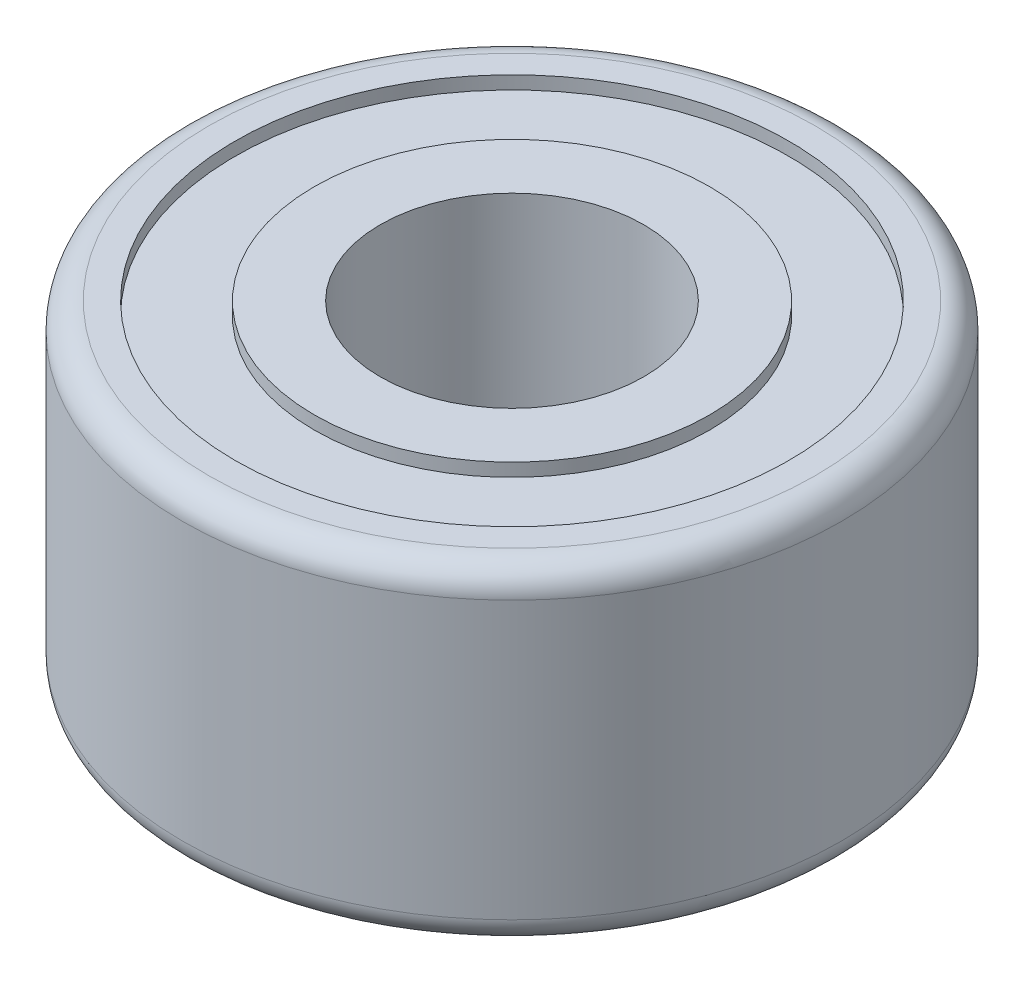
ISO-10303-21;
HEADER;
FILE_DESCRIPTION(('STEP AP214'),'2;1');
FILE_NAME('part.step','',(''),(''),'','','');
FILE_SCHEMA(('AUTOMOTIVE_DESIGN { 1 0 10303 214 1 1 1 1 }'));
ENDSEC;
DATA;
#1=APPLICATION_CONTEXT('core data for automotive mechanical design processes');
#2=APPLICATION_PROTOCOL_DEFINITION('international standard','automotive_design',2000,#1);
#3=PRODUCT_CONTEXT('',#1,'mechanical');
#4=PRODUCT('Part','Part','',(#3));
#5=PRODUCT_RELATED_PRODUCT_CATEGORY('part','',(#4));
#6=PRODUCT_DEFINITION_FORMATION('','',#4);
#7=PRODUCT_DEFINITION_CONTEXT('part definition',#1,'design');
#8=PRODUCT_DEFINITION('design','',#6,#7);
#9=PRODUCT_DEFINITION_SHAPE('','',#8);
#10=(LENGTH_UNIT() NAMED_UNIT(*) SI_UNIT(.MILLI.,.METRE.));
#11=(NAMED_UNIT(*) PLANE_ANGLE_UNIT() SI_UNIT($,.RADIAN.));
#12=(NAMED_UNIT(*) SI_UNIT($,.STERADIAN.) SOLID_ANGLE_UNIT());
#13=UNCERTAINTY_MEASURE_WITH_UNIT(LENGTH_MEASURE(1.E-05),#10,'distance_accuracy_value','');
#14=(GEOMETRIC_REPRESENTATION_CONTEXT(3) GLOBAL_UNCERTAINTY_ASSIGNED_CONTEXT((#13)) GLOBAL_UNIT_ASSIGNED_CONTEXT((#10,
#11,#12)) REPRESENTATION_CONTEXT('',''));
#15=CARTESIAN_POINT('',(0.,0.,0.));
#16=DIRECTION('',(0.,0.,1.));
#17=DIRECTION('',(1.,0.,0.));
#18=AXIS2_PLACEMENT_3D('',#15,#16,#17);
#19=CARTESIAN_POINT('',(0.,0.,0.));
#20=DIRECTION('',(0.,1.,0.));
#21=DIRECTION('',(0.,0.,1.));
#22=AXIS2_PLACEMENT_3D('',#19,#20,#21);
#23=PLANE('',#22);
#24=CARTESIAN_POINT('',(0.,0.,0.));
#25=DIRECTION('',(0.,1.,0.));
#26=DIRECTION('',(0.,0.,1.));
#27=AXIS2_PLACEMENT_3D('',#24,#25,#26);
#28=CIRCLE('',#27,1.);
#29=CARTESIAN_POINT('',(0.,0.,1.));
#30=VERTEX_POINT('',#29);
#31=EDGE_CURVE('E59',#30,#30,#28,.T.);
#32=ORIENTED_EDGE('',*,*,#31,.T.);
#33=EDGE_LOOP('',(#32));
#34=FACE_BOUND('',#33,.T.);
#35=CARTESIAN_POINT('',(0.,0.,0.));
#36=DIRECTION('',(0.,-1.,0.));
#37=DIRECTION('',(0.,0.,-1.));
#38=AXIS2_PLACEMENT_3D('',#35,#36,#37);
#39=CIRCLE('',#38,1.5);
#40=CARTESIAN_POINT('',(0.,0.,-1.5));
#41=VERTEX_POINT('',#40);
#42=EDGE_CURVE('E85',#41,#41,#39,.T.);
#43=ORIENTED_EDGE('',*,*,#42,.T.);
#44=EDGE_LOOP('',(#43));
#45=FACE_BOUND('',#44,.T.);
#46=ADVANCED_FACE('F40',(#34,#45),#23,.F.);
#47=CARTESIAN_POINT('',(0.,2.5,0.));
#48=DIRECTION('',(0.,1.,0.));
#49=DIRECTION('',(0.,0.,1.));
#50=AXIS2_PLACEMENT_3D('',#47,#48,#49);
#51=PLANE('',#50);
#52=CARTESIAN_POINT('',(0.,2.5,0.));
#53=DIRECTION('',(0.,1.,0.));
#54=DIRECTION('',(0.,0.,1.));
#55=AXIS2_PLACEMENT_3D('',#52,#53,#54);
#56=CIRCLE('',#55,1.);
#57=CARTESIAN_POINT('',(0.,2.5,1.));
#58=VERTEX_POINT('',#57);
#59=EDGE_CURVE('E60',#58,#58,#56,.T.);
#60=ORIENTED_EDGE('',*,*,#59,.F.);
#61=EDGE_LOOP('',(#60));
#62=FACE_BOUND('',#61,.T.);
#63=CARTESIAN_POINT('',(0.,2.5,0.));
#64=DIRECTION('',(0.,1.,0.));
#65=DIRECTION('',(0.,0.,1.));
#66=AXIS2_PLACEMENT_3D('',#63,#64,#65);
#67=CIRCLE('',#66,1.5);
#68=CARTESIAN_POINT('',(0.,2.5,1.5));
#69=VERTEX_POINT('',#68);
#70=EDGE_CURVE('E69',#69,#69,#67,.T.);
#71=ORIENTED_EDGE('',*,*,#70,.T.);
#72=EDGE_LOOP('',(#71));
#73=FACE_BOUND('',#72,.T.);
#74=ADVANCED_FACE('F116',(#62,#73),#51,.T.);
#75=CARTESIAN_POINT('',(0.,2.5,0.));
#76=DIRECTION('',(0.,1.,0.));
#77=DIRECTION('',(0.,0.,1.));
#78=AXIS2_PLACEMENT_3D('',#75,#76,#77);
#79=CIRCLE('',#78,2.1);
#80=CARTESIAN_POINT('',(0.,2.5,2.1));
#81=VERTEX_POINT('',#80);
#82=EDGE_CURVE('E63',#81,#81,#79,.T.);
#83=ORIENTED_EDGE('',*,*,#82,.F.);
#84=EDGE_LOOP('',(#83));
#85=FACE_BOUND('',#84,.T.);
#86=CARTESIAN_POINT('',(0.,2.5,0.));
#87=DIRECTION('',(0.,1.,0.));
#88=DIRECTION('',(0.,0.,1.));
#89=AXIS2_PLACEMENT_3D('',#86,#87,#88);
#90=CIRCLE('',#89,2.3);
#91=CARTESIAN_POINT('',(0.,2.5,2.3));
#92=VERTEX_POINT('',#91);
#93=EDGE_CURVE('E10',#92,#92,#90,.T.);
#94=ORIENTED_EDGE('',*,*,#93,.T.);
#95=EDGE_LOOP('',(#94));
#96=FACE_BOUND('',#95,.T.);
#97=ADVANCED_FACE('F110',(#85,#96),#51,.T.);
#98=CARTESIAN_POINT('',(0.,0.,0.));
#99=DIRECTION('',(0.,-1.,0.));
#100=DIRECTION('',(0.,0.,-1.));
#101=AXIS2_PLACEMENT_3D('',#98,#99,#100);
#102=CIRCLE('',#101,2.1);
#103=CARTESIAN_POINT('',(0.,0.,-2.1));
#104=VERTEX_POINT('',#103);
#105=EDGE_CURVE('E79',#104,#104,#102,.T.);
#106=ORIENTED_EDGE('',*,*,#105,.F.);
#107=EDGE_LOOP('',(#106));
#108=FACE_BOUND('',#107,.T.);
#109=CARTESIAN_POINT('',(0.,0.,0.));
#110=DIRECTION('',(0.,1.,0.));
#111=DIRECTION('',(0.,0.,1.));
#112=AXIS2_PLACEMENT_3D('',#109,#110,#111);
#113=CIRCLE('',#112,2.3);
#114=CARTESIAN_POINT('',(0.,0.,2.3));
#115=VERTEX_POINT('',#114);
#116=EDGE_CURVE('E42',#115,#115,#113,.F.);
#117=ORIENTED_EDGE('',*,*,#116,.T.);
#118=EDGE_LOOP('',(#117));
#119=FACE_BOUND('',#118,.T.);
#120=ADVANCED_FACE('F102',(#108,#119),#23,.F.);
#121=CARTESIAN_POINT('',(0.,2.5,0.));
#122=DIRECTION('',(0.,-1.,0.));
#123=DIRECTION('',(0.,0.,-1.));
#124=AXIS2_PLACEMENT_3D('',#121,#122,#123);
#125=CYLINDRICAL_SURFACE('',#124,2.5);
#126=CARTESIAN_POINT('',(0.,0.2,0.));
#127=DIRECTION('',(0.,1.,0.));
#128=DIRECTION('',(0.,0.,1.));
#129=AXIS2_PLACEMENT_3D('',#126,#127,#128);
#130=CIRCLE('',#129,2.5);
#131=CARTESIAN_POINT('',(0.,0.2,2.5));
#132=VERTEX_POINT('',#131);
#133=EDGE_CURVE('E48',#132,#132,#130,.T.);
#134=ORIENTED_EDGE('',*,*,#133,.T.);
#135=EDGE_LOOP('',(#134));
#136=FACE_BOUND('',#135,.T.);
#137=CARTESIAN_POINT('',(0.,2.3,0.));
#138=DIRECTION('',(0.,1.,0.));
#139=DIRECTION('',(0.,0.,1.));
#140=AXIS2_PLACEMENT_3D('',#137,#138,#139);
#141=CIRCLE('',#140,2.5);
#142=CARTESIAN_POINT('',(0.,2.3,2.5));
#143=VERTEX_POINT('',#142);
#144=EDGE_CURVE('E55',#143,#143,#141,.F.);
#145=ORIENTED_EDGE('',*,*,#144,.T.);
#146=EDGE_LOOP('',(#145));
#147=FACE_BOUND('',#146,.T.);
#148=ADVANCED_FACE('F106',(#136,#147),#125,.T.);
#149=CARTESIAN_POINT('',(0.,2.5,0.));
#150=DIRECTION('',(0.,-1.,0.));
#151=DIRECTION('',(0.,0.,-1.));
#152=AXIS2_PLACEMENT_3D('',#149,#150,#151);
#153=CYLINDRICAL_SURFACE('',#152,1.);
#154=ORIENTED_EDGE('',*,*,#59,.T.);
#155=EDGE_LOOP('',(#154));
#156=FACE_BOUND('',#155,.T.);
#157=ORIENTED_EDGE('',*,*,#31,.F.);
#158=EDGE_LOOP('',(#157));
#159=FACE_BOUND('',#158,.T.);
#160=ADVANCED_FACE('F114',(#156,#159),#153,.F.);
#161=CARTESIAN_POINT('',(0.,0.2,0.));
#162=DIRECTION('',(0.,1.,0.));
#163=DIRECTION('',(0.,0.,1.));
#164=AXIS2_PLACEMENT_3D('',#161,#162,#163);
#165=TOROIDAL_SURFACE('',#164,2.3,0.2);
#166=ORIENTED_EDGE('',*,*,#116,.F.);
#167=EDGE_LOOP('',(#166));
#168=FACE_BOUND('',#167,.T.);
#169=ORIENTED_EDGE('',*,*,#133,.F.);
#170=EDGE_LOOP('',(#169));
#171=FACE_BOUND('',#170,.T.);
#172=ADVANCED_FACE('F144',(#168,#171),#165,.T.);
#173=CARTESIAN_POINT('',(0.,2.3,0.));
#174=DIRECTION('',(0.,1.,0.));
#175=DIRECTION('',(0.,0.,1.));
#176=AXIS2_PLACEMENT_3D('',#173,#174,#175);
#177=TOROIDAL_SURFACE('',#176,2.3,0.2);
#178=ORIENTED_EDGE('',*,*,#144,.F.);
#179=EDGE_LOOP('',(#178));
#180=FACE_BOUND('',#179,.T.);
#181=ORIENTED_EDGE('',*,*,#93,.F.);
#182=EDGE_LOOP('',(#181));
#183=FACE_BOUND('',#182,.T.);
#184=ADVANCED_FACE('F39',(#180,#183),#177,.T.);
#185=CARTESIAN_POINT('',(0.,2.4,0.));
#186=DIRECTION('',(0.,1.,0.));
#187=DIRECTION('',(0.,0.,1.));
#188=AXIS2_PLACEMENT_3D('',#185,#186,#187);
#189=CYLINDRICAL_SURFACE('',#188,2.1);
#190=CARTESIAN_POINT('',(0.,2.4,0.));
#191=DIRECTION('',(0.,1.,0.));
#192=DIRECTION('',(0.,0.,1.));
#193=AXIS2_PLACEMENT_3D('',#190,#191,#192);
#194=CIRCLE('',#193,2.1);
#195=CARTESIAN_POINT('',(0.,2.4,2.1));
#196=VERTEX_POINT('',#195);
#197=EDGE_CURVE('E64',#196,#196,#194,.T.);
#198=ORIENTED_EDGE('',*,*,#197,.F.);
#199=EDGE_LOOP('',(#198));
#200=FACE_BOUND('',#199,.T.);
#201=ORIENTED_EDGE('',*,*,#82,.T.);
#202=EDGE_LOOP('',(#201));
#203=FACE_BOUND('',#202,.T.);
#204=ADVANCED_FACE('F137',(#200,#203),#189,.F.);
#205=CARTESIAN_POINT('',(0.,2.4,0.));
#206=DIRECTION('',(0.,1.,0.));
#207=DIRECTION('',(0.,0.,1.));
#208=AXIS2_PLACEMENT_3D('',#205,#206,#207);
#209=PLANE('',#208);
#210=CARTESIAN_POINT('',(0.,2.4,0.));
#211=DIRECTION('',(0.,1.,0.));
#212=DIRECTION('',(0.,0.,1.));
#213=AXIS2_PLACEMENT_3D('',#210,#211,#212);
#214=CIRCLE('',#213,1.5);
#215=CARTESIAN_POINT('',(0.,2.4,1.5));
#216=VERTEX_POINT('',#215);
#217=EDGE_CURVE('E70',#216,#216,#214,.T.);
#218=ORIENTED_EDGE('',*,*,#217,.F.);
#219=EDGE_LOOP('',(#218));
#220=FACE_BOUND('',#219,.T.);
#221=ORIENTED_EDGE('',*,*,#197,.T.);
#222=EDGE_LOOP('',(#221));
#223=FACE_BOUND('',#222,.T.);
#224=ADVANCED_FACE('F132',(#220,#223),#209,.T.);
#225=CARTESIAN_POINT('',(0.,2.4,0.));
#226=DIRECTION('',(0.,1.,0.));
#227=DIRECTION('',(0.,0.,1.));
#228=AXIS2_PLACEMENT_3D('',#225,#226,#227);
#229=CYLINDRICAL_SURFACE('',#228,1.5);
#230=ORIENTED_EDGE('',*,*,#217,.T.);
#231=EDGE_LOOP('',(#230));
#232=FACE_BOUND('',#231,.T.);
#233=ORIENTED_EDGE('',*,*,#70,.F.);
#234=EDGE_LOOP('',(#233));
#235=FACE_BOUND('',#234,.T.);
#236=ADVANCED_FACE('F99',(#232,#235),#229,.T.);
#237=CARTESIAN_POINT('',(0.,0.1,0.));
#238=DIRECTION('',(0.,-1.,0.));
#239=DIRECTION('',(0.,0.,-1.));
#240=AXIS2_PLACEMENT_3D('',#237,#238,#239);
#241=CYLINDRICAL_SURFACE('',#240,2.1);
#242=CARTESIAN_POINT('',(0.,0.1,0.));
#243=DIRECTION('',(0.,-1.,0.));
#244=DIRECTION('',(0.,0.,-1.));
#245=AXIS2_PLACEMENT_3D('',#242,#243,#244);
#246=CIRCLE('',#245,2.1);
#247=CARTESIAN_POINT('',(0.,0.1,-2.1));
#248=VERTEX_POINT('',#247);
#249=EDGE_CURVE('E71',#248,#248,#246,.T.);
#250=ORIENTED_EDGE('',*,*,#249,.F.);
#251=EDGE_LOOP('',(#250));
#252=FACE_BOUND('',#251,.T.);
#253=ORIENTED_EDGE('',*,*,#105,.T.);
#254=EDGE_LOOP('',(#253));
#255=FACE_BOUND('',#254,.T.);
#256=ADVANCED_FACE('F94',(#252,#255),#241,.F.);
#257=CARTESIAN_POINT('',(0.,0.1,0.));
#258=DIRECTION('',(0.,-1.,0.));
#259=DIRECTION('',(0.,0.,-1.));
#260=AXIS2_PLACEMENT_3D('',#257,#258,#259);
#261=PLANE('',#260);
#262=CARTESIAN_POINT('',(0.,0.1,0.));
#263=DIRECTION('',(0.,-1.,0.));
#264=DIRECTION('',(0.,0.,-1.));
#265=AXIS2_PLACEMENT_3D('',#262,#263,#264);
#266=CIRCLE('',#265,1.5);
#267=CARTESIAN_POINT('',(0.,0.1,-1.5));
#268=VERTEX_POINT('',#267);
#269=EDGE_CURVE('E78',#268,#268,#266,.T.);
#270=ORIENTED_EDGE('',*,*,#269,.F.);
#271=EDGE_LOOP('',(#270));
#272=FACE_BOUND('',#271,.T.);
#273=ORIENTED_EDGE('',*,*,#249,.T.);
#274=EDGE_LOOP('',(#273));
#275=FACE_BOUND('',#274,.T.);
#276=ADVANCED_FACE('F93',(#272,#275),#261,.T.);
#277=CARTESIAN_POINT('',(0.,0.1,0.));
#278=DIRECTION('',(0.,-1.,0.));
#279=DIRECTION('',(0.,0.,-1.));
#280=AXIS2_PLACEMENT_3D('',#277,#278,#279);
#281=CYLINDRICAL_SURFACE('',#280,1.5);
#282=ORIENTED_EDGE('',*,*,#269,.T.);
#283=EDGE_LOOP('',(#282));
#284=FACE_BOUND('',#283,.T.);
#285=ORIENTED_EDGE('',*,*,#42,.F.);
#286=EDGE_LOOP('',(#285));
#287=FACE_BOUND('',#286,.T.);
#288=ADVANCED_FACE('F86',(#284,#287),#281,.T.);
#289=CLOSED_SHELL('',(#46,#74,#97,#120,#148,#160,#172,#184,#204,#224,#236,#256,#276,#288));
#290=MANIFOLD_SOLID_BREP('B2',#289);
#291=ADVANCED_BREP_SHAPE_REPRESENTATION('',(#18,#290),#14);
#292=SHAPE_DEFINITION_REPRESENTATION(#9,#291);
ENDSEC;
END-ISO-10303-21;
